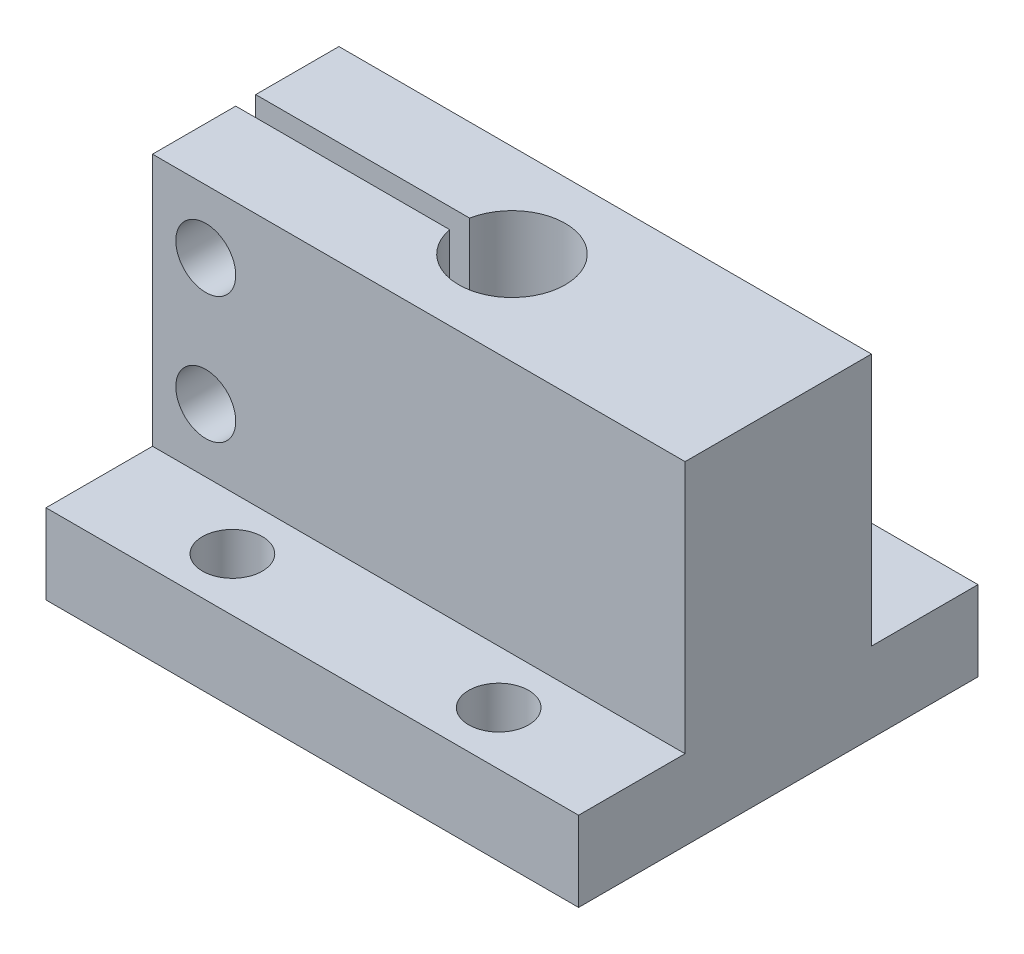
ISO-10303-21;
HEADER;
FILE_DESCRIPTION(('STEP AP214'),'2;1');
FILE_NAME('part.step','',(''),(''),'','','');
FILE_SCHEMA(('AUTOMOTIVE_DESIGN { 1 0 10303 214 1 1 1 1 }'));
ENDSEC;
DATA;
#1=APPLICATION_CONTEXT('core data for automotive mechanical design processes');
#2=APPLICATION_PROTOCOL_DEFINITION('international standard','automotive_design',2000,#1);
#3=PRODUCT_CONTEXT('',#1,'mechanical');
#4=PRODUCT('Part','Part','',(#3));
#5=PRODUCT_RELATED_PRODUCT_CATEGORY('part','',(#4));
#6=PRODUCT_DEFINITION_FORMATION('','',#4);
#7=PRODUCT_DEFINITION_CONTEXT('part definition',#1,'design');
#8=PRODUCT_DEFINITION('design','',#6,#7);
#9=PRODUCT_DEFINITION_SHAPE('','',#8);
#10=(LENGTH_UNIT() NAMED_UNIT(*) SI_UNIT(.MILLI.,.METRE.));
#11=(NAMED_UNIT(*) PLANE_ANGLE_UNIT() SI_UNIT($,.RADIAN.));
#12=(NAMED_UNIT(*) SI_UNIT($,.STERADIAN.) SOLID_ANGLE_UNIT());
#13=UNCERTAINTY_MEASURE_WITH_UNIT(LENGTH_MEASURE(1.E-05),#10,'distance_accuracy_value','');
#14=(GEOMETRIC_REPRESENTATION_CONTEXT(3) GLOBAL_UNCERTAINTY_ASSIGNED_CONTEXT((#13)) GLOBAL_UNIT_ASSIGNED_CONTEXT((#10,
#11,#12)) REPRESENTATION_CONTEXT('',''));
#15=CARTESIAN_POINT('',(0.,0.,0.));
#16=DIRECTION('',(0.,0.,1.));
#17=DIRECTION('',(1.,0.,0.));
#18=AXIS2_PLACEMENT_3D('',#15,#16,#17);
#19=CARTESIAN_POINT('',(-20.,25.,0.));
#20=DIRECTION('',(1.,0.,0.));
#21=DIRECTION('',(0.,0.,-1.));
#22=AXIS2_PLACEMENT_3D('',#19,#20,#21);
#23=PLANE('',#22);
#24=DIRECTION('',(0.,0.,1.));
#25=VECTOR('',#24,1.);
#26=CARTESIAN_POINT('',(-20.,0.,0.));
#27=LINE('',#26,#25);
#28=CARTESIAN_POINT('',(-20.,0.,-15.));
#29=VERTEX_POINT('',#28);
#30=CARTESIAN_POINT('',(-20.,0.,-0.749999999999999));
#31=VERTEX_POINT('',#30);
#32=EDGE_CURVE('E153',#29,#31,#27,.T.);
#33=ORIENTED_EDGE('',*,*,#32,.T.);
#34=DIRECTION('',(0.,1.,0.));
#35=VECTOR('',#34,1.);
#36=CARTESIAN_POINT('',(-20.,0.,-0.749999999999999));
#37=LINE('',#36,#35);
#38=CARTESIAN_POINT('',(-20.,25.,-0.749999999999999));
#39=VERTEX_POINT('',#38);
#40=EDGE_CURVE('E58',#31,#39,#37,.T.);
#41=ORIENTED_EDGE('',*,*,#40,.T.);
#42=DIRECTION('',(0.,0.,1.));
#43=VECTOR('',#42,1.);
#44=CARTESIAN_POINT('',(-20.,25.,0.));
#45=LINE('',#44,#43);
#46=CARTESIAN_POINT('',(-20.,25.,-7.));
#47=VERTEX_POINT('',#46);
#48=EDGE_CURVE('E165',#47,#39,#45,.T.);
#49=ORIENTED_EDGE('',*,*,#48,.F.);
#50=DIRECTION('',(0.,-1.,0.));
#51=VECTOR('',#50,1.);
#52=CARTESIAN_POINT('',(-20.,25.,-7.));
#53=LINE('',#52,#51);
#54=CARTESIAN_POINT('',(-20.,6.,-7.));
#55=VERTEX_POINT('',#54);
#56=EDGE_CURVE('E164',#47,#55,#53,.T.);
#57=ORIENTED_EDGE('',*,*,#56,.T.);
#58=DIRECTION('',(0.,0.,1.));
#59=VECTOR('',#58,1.);
#60=CARTESIAN_POINT('',(-20.,6.,0.));
#61=LINE('',#60,#59);
#62=CARTESIAN_POINT('',(-20.,6.,-15.));
#63=VERTEX_POINT('',#62);
#64=EDGE_CURVE('E214',#63,#55,#61,.T.);
#65=ORIENTED_EDGE('',*,*,#64,.F.);
#66=DIRECTION('',(0.,-1.,0.));
#67=VECTOR('',#66,1.);
#68=CARTESIAN_POINT('',(-20.,6.,-15.));
#69=LINE('',#68,#67);
#70=EDGE_CURVE('E222',#63,#29,#69,.T.);
#71=ORIENTED_EDGE('',*,*,#70,.T.);
#72=EDGE_LOOP('',(#33,#41,#49,#57,#65,#71));
#73=FACE_BOUND('',#72,.T.);
#74=ADVANCED_FACE('F41',(#73),#23,.F.);
#75=CARTESIAN_POINT('',(0.,25.,7.));
#76=DIRECTION('',(0.,0.,1.));
#77=DIRECTION('',(1.,0.,0.));
#78=AXIS2_PLACEMENT_3D('',#75,#76,#77);
#79=PLANE('',#78);
#80=CARTESIAN_POINT('',(-16.,20.25,7.));
#81=DIRECTION('',(0.,0.,1.));
#82=DIRECTION('',(1.,0.,0.));
#83=AXIS2_PLACEMENT_3D('',#80,#81,#82);
#84=CIRCLE('',#83,2.25);
#85=CARTESIAN_POINT('',(-13.75,20.25,7.));
#86=VERTEX_POINT('',#85);
#87=EDGE_CURVE('E175',#86,#86,#84,.T.);
#88=ORIENTED_EDGE('',*,*,#87,.F.);
#89=EDGE_LOOP('',(#88));
#90=FACE_BOUND('',#89,.T.);
#91=CARTESIAN_POINT('',(-16.,10.75,7.));
#92=DIRECTION('',(0.,0.,1.));
#93=DIRECTION('',(-1.,0.,0.));
#94=AXIS2_PLACEMENT_3D('',#91,#92,#93);
#95=CIRCLE('',#94,2.25);
#96=CARTESIAN_POINT('',(-18.25,10.75,7.));
#97=VERTEX_POINT('',#96);
#98=EDGE_CURVE('E182',#97,#97,#95,.T.);
#99=ORIENTED_EDGE('',*,*,#98,.F.);
#100=EDGE_LOOP('',(#99));
#101=FACE_BOUND('',#100,.T.);
#102=DIRECTION('',(-1.,0.,0.));
#103=VECTOR('',#102,1.);
#104=CARTESIAN_POINT('',(0.,6.,7.));
#105=LINE('',#104,#103);
#106=CARTESIAN_POINT('',(20.,6.,7.));
#107=VERTEX_POINT('',#106);
#108=CARTESIAN_POINT('',(-20.,6.,7.));
#109=VERTEX_POINT('',#108);
#110=EDGE_CURVE('E238',#107,#109,#105,.T.);
#111=ORIENTED_EDGE('',*,*,#110,.F.);
#112=DIRECTION('',(0.,-1.,0.));
#113=VECTOR('',#112,1.);
#114=CARTESIAN_POINT('',(20.,25.,7.));
#115=LINE('',#114,#113);
#116=CARTESIAN_POINT('',(20.,25.,7.));
#117=VERTEX_POINT('',#116);
#118=EDGE_CURVE('E50',#117,#107,#115,.T.);
#119=ORIENTED_EDGE('',*,*,#118,.F.);
#120=DIRECTION('',(-1.,0.,0.));
#121=VECTOR('',#120,1.);
#122=CARTESIAN_POINT('',(0.,25.,7.));
#123=LINE('',#122,#121);
#124=CARTESIAN_POINT('',(-20.,25.,7.));
#125=VERTEX_POINT('',#124);
#126=EDGE_CURVE('E266',#117,#125,#123,.T.);
#127=ORIENTED_EDGE('',*,*,#126,.T.);
#128=DIRECTION('',(0.,-1.,0.));
#129=VECTOR('',#128,1.);
#130=CARTESIAN_POINT('',(-20.,25.,7.));
#131=LINE('',#130,#129);
#132=EDGE_CURVE('E162',#125,#109,#131,.T.);
#133=ORIENTED_EDGE('',*,*,#132,.T.);
#134=EDGE_LOOP('',(#111,#119,#127,#133));
#135=FACE_BOUND('',#134,.T.);
#136=ADVANCED_FACE('F305',(#90,#101,#135),#79,.T.);
#137=CARTESIAN_POINT('',(20.,25.,0.));
#138=DIRECTION('',(1.,0.,0.));
#139=DIRECTION('',(0.,0.,-1.));
#140=AXIS2_PLACEMENT_3D('',#137,#138,#139);
#141=PLANE('',#140);
#142=DIRECTION('',(0.,0.,1.));
#143=VECTOR('',#142,1.);
#144=CARTESIAN_POINT('',(20.,0.,0.));
#145=LINE('',#144,#143);
#146=CARTESIAN_POINT('',(20.,0.,-15.));
#147=VERTEX_POINT('',#146);
#148=CARTESIAN_POINT('',(20.,0.,15.));
#149=VERTEX_POINT('',#148);
#150=EDGE_CURVE('E154',#147,#149,#145,.T.);
#151=ORIENTED_EDGE('',*,*,#150,.F.);
#152=DIRECTION('',(0.,-1.,0.));
#153=VECTOR('',#152,1.);
#154=CARTESIAN_POINT('',(20.,6.,-15.));
#155=LINE('',#154,#153);
#156=CARTESIAN_POINT('',(20.,6.,-15.));
#157=VERTEX_POINT('',#156);
#158=EDGE_CURVE('E232',#157,#147,#155,.T.);
#159=ORIENTED_EDGE('',*,*,#158,.F.);
#160=DIRECTION('',(0.,0.,1.));
#161=VECTOR('',#160,1.);
#162=CARTESIAN_POINT('',(20.,6.,0.));
#163=LINE('',#162,#161);
#164=CARTESIAN_POINT('',(20.,6.,-7.));
#165=VERTEX_POINT('',#164);
#166=EDGE_CURVE('E208',#157,#165,#163,.T.);
#167=ORIENTED_EDGE('',*,*,#166,.T.);
#168=DIRECTION('',(0.,-1.,0.));
#169=VECTOR('',#168,1.);
#170=CARTESIAN_POINT('',(20.,25.,-7.));
#171=LINE('',#170,#169);
#172=CARTESIAN_POINT('',(20.,25.,-7.));
#173=VERTEX_POINT('',#172);
#174=EDGE_CURVE('E168',#173,#165,#171,.T.);
#175=ORIENTED_EDGE('',*,*,#174,.F.);
#176=DIRECTION('',(0.,0.,1.));
#177=VECTOR('',#176,1.);
#178=CARTESIAN_POINT('',(20.,25.,0.));
#179=LINE('',#178,#177);
#180=EDGE_CURVE('E269',#173,#117,#179,.T.);
#181=ORIENTED_EDGE('',*,*,#180,.T.);
#182=ORIENTED_EDGE('',*,*,#118,.T.);
#183=DIRECTION('',(0.,0.,1.));
#184=VECTOR('',#183,1.);
#185=CARTESIAN_POINT('',(20.,6.,0.));
#186=LINE('',#185,#184);
#187=CARTESIAN_POINT('',(20.,6.,15.));
#188=VERTEX_POINT('',#187);
#189=EDGE_CURVE('E235',#107,#188,#186,.T.);
#190=ORIENTED_EDGE('',*,*,#189,.T.);
#191=DIRECTION('',(0.,-1.,0.));
#192=VECTOR('',#191,1.);
#193=CARTESIAN_POINT('',(20.,6.,15.));
#194=LINE('',#193,#192);
#195=EDGE_CURVE('E253',#188,#149,#194,.T.);
#196=ORIENTED_EDGE('',*,*,#195,.T.);
#197=EDGE_LOOP('',(#151,#159,#167,#175,#181,#182,#190,#196));
#198=FACE_BOUND('',#197,.T.);
#199=ADVANCED_FACE('F295',(#198),#141,.T.);
#200=CARTESIAN_POINT('',(0.,25.,-7.));
#201=DIRECTION('',(0.,0.,1.));
#202=DIRECTION('',(1.,0.,0.));
#203=AXIS2_PLACEMENT_3D('',#200,#201,#202);
#204=PLANE('',#203);
#205=CARTESIAN_POINT('',(-16.,20.25,-7.));
#206=DIRECTION('',(0.,0.,1.));
#207=DIRECTION('',(1.,0.,0.));
#208=AXIS2_PLACEMENT_3D('',#205,#206,#207);
#209=CIRCLE('',#208,2.25);
#210=CARTESIAN_POINT('',(-13.75,20.25,-7.));
#211=VERTEX_POINT('',#210);
#212=EDGE_CURVE('E194',#211,#211,#209,.T.);
#213=ORIENTED_EDGE('',*,*,#212,.T.);
#214=EDGE_LOOP('',(#213));
#215=FACE_BOUND('',#214,.T.);
#216=CARTESIAN_POINT('',(-16.,10.75,-7.));
#217=DIRECTION('',(0.,0.,1.));
#218=DIRECTION('',(1.,0.,0.));
#219=AXIS2_PLACEMENT_3D('',#216,#217,#218);
#220=CIRCLE('',#219,2.25);
#221=CARTESIAN_POINT('',(-13.75,10.75,-7.));
#222=VERTEX_POINT('',#221);
#223=EDGE_CURVE('E179',#222,#222,#220,.T.);
#224=ORIENTED_EDGE('',*,*,#223,.T.);
#225=EDGE_LOOP('',(#224));
#226=FACE_BOUND('',#225,.T.);
#227=ORIENTED_EDGE('',*,*,#174,.T.);
#228=DIRECTION('',(-1.,0.,0.));
#229=VECTOR('',#228,1.);
#230=CARTESIAN_POINT('',(0.,6.,-7.));
#231=LINE('',#230,#229);
#232=EDGE_CURVE('E205',#165,#55,#231,.T.);
#233=ORIENTED_EDGE('',*,*,#232,.T.);
#234=ORIENTED_EDGE('',*,*,#56,.F.);
#235=DIRECTION('',(-1.,0.,0.));
#236=VECTOR('',#235,1.);
#237=CARTESIAN_POINT('',(0.,25.,-7.));
#238=LINE('',#237,#236);
#239=EDGE_CURVE('E272',#173,#47,#238,.T.);
#240=ORIENTED_EDGE('',*,*,#239,.F.);
#241=EDGE_LOOP('',(#227,#233,#234,#240));
#242=FACE_BOUND('',#241,.T.);
#243=ADVANCED_FACE('F308',(#215,#226,#242),#204,.F.);
#244=CARTESIAN_POINT('',(0.,25.,0.));
#245=DIRECTION('',(0.,-1.,0.));
#246=DIRECTION('',(0.,0.,-1.));
#247=AXIS2_PLACEMENT_3D('',#244,#245,#246);
#248=CYLINDRICAL_SURFACE('',#247,4.);
#249=DIRECTION('',(0.,-1.,0.));
#250=VECTOR('',#249,1.);
#251=CARTESIAN_POINT('',(-3.92905841137541,25.,-0.749999999999999));
#252=LINE('',#251,#250);
#253=CARTESIAN_POINT('',(-3.92905841137541,0.,-0.749999999999999));
#254=VERTEX_POINT('',#253);
#255=CARTESIAN_POINT('',(-3.92905841137541,25.,-0.749999999999999));
#256=VERTEX_POINT('',#255);
#257=EDGE_CURVE('E202',#254,#256,#252,.F.);
#258=ORIENTED_EDGE('',*,*,#257,.F.);
#259=CARTESIAN_POINT('',(0.,0.,0.));
#260=DIRECTION('',(0.,1.,0.));
#261=DIRECTION('',(0.,0.,1.));
#262=AXIS2_PLACEMENT_3D('',#259,#260,#261);
#263=CIRCLE('',#262,4.);
#264=CARTESIAN_POINT('',(-3.92905841137541,0.,0.750000000000001));
#265=VERTEX_POINT('',#264);
#266=EDGE_CURVE('E158',#265,#254,#263,.T.);
#267=ORIENTED_EDGE('',*,*,#266,.F.);
#268=DIRECTION('',(0.,-1.,0.));
#269=VECTOR('',#268,1.);
#270=CARTESIAN_POINT('',(-3.92905841137541,25.,0.750000000000001));
#271=LINE('',#270,#269);
#272=CARTESIAN_POINT('',(-3.92905841137541,25.,0.750000000000001));
#273=VERTEX_POINT('',#272);
#274=EDGE_CURVE('E65',#273,#265,#271,.T.);
#275=ORIENTED_EDGE('',*,*,#274,.F.);
#276=CARTESIAN_POINT('',(0.,25.,0.));
#277=DIRECTION('',(0.,1.,0.));
#278=DIRECTION('',(0.,0.,1.));
#279=AXIS2_PLACEMENT_3D('',#276,#277,#278);
#280=CIRCLE('',#279,4.);
#281=EDGE_CURVE('E157',#273,#256,#280,.T.);
#282=ORIENTED_EDGE('',*,*,#281,.T.);
#283=EDGE_LOOP('',(#258,#267,#275,#282));
#284=FACE_BOUND('',#283,.T.);
#285=ADVANCED_FACE('F43',(#284),#248,.F.);
#286=CARTESIAN_POINT('',(-20.,25.,0.750000000000001));
#287=VERTEX_POINT('',#286);
#288=EDGE_CURVE('E146',#287,#125,#45,.T.);
#289=ORIENTED_EDGE('',*,*,#288,.F.);
#290=DIRECTION('',(0.,1.,0.));
#291=VECTOR('',#290,1.);
#292=CARTESIAN_POINT('',(-20.,0.,0.750000000000001));
#293=LINE('',#292,#291);
#294=CARTESIAN_POINT('',(-20.,0.,0.750000000000001));
#295=VERTEX_POINT('',#294);
#296=EDGE_CURVE('E131',#295,#287,#293,.T.);
#297=ORIENTED_EDGE('',*,*,#296,.F.);
#298=CARTESIAN_POINT('',(-20.,0.,15.));
#299=VERTEX_POINT('',#298);
#300=EDGE_CURVE('E143',#295,#299,#27,.T.);
#301=ORIENTED_EDGE('',*,*,#300,.T.);
#302=DIRECTION('',(0.,-1.,0.));
#303=VECTOR('',#302,1.);
#304=CARTESIAN_POINT('',(-20.,6.,15.));
#305=LINE('',#304,#303);
#306=CARTESIAN_POINT('',(-20.,6.,15.));
#307=VERTEX_POINT('',#306);
#308=EDGE_CURVE('E262',#307,#299,#305,.T.);
#309=ORIENTED_EDGE('',*,*,#308,.F.);
#310=DIRECTION('',(0.,0.,1.));
#311=VECTOR('',#310,1.);
#312=CARTESIAN_POINT('',(-20.,6.,0.));
#313=LINE('',#312,#311);
#314=EDGE_CURVE('E242',#109,#307,#313,.T.);
#315=ORIENTED_EDGE('',*,*,#314,.F.);
#316=ORIENTED_EDGE('',*,*,#132,.F.);
#317=EDGE_LOOP('',(#289,#297,#301,#309,#315,#316));
#318=FACE_BOUND('',#317,.T.);
#319=ADVANCED_FACE('F141',(#318),#23,.F.);
#320=CARTESIAN_POINT('',(0.,25.,0.));
#321=DIRECTION('',(0.,1.,0.));
#322=DIRECTION('',(0.,0.,1.));
#323=AXIS2_PLACEMENT_3D('',#320,#321,#322);
#324=PLANE('',#323);
#325=DIRECTION('',(-1.,0.,0.));
#326=VECTOR('',#325,1.);
#327=CARTESIAN_POINT('',(0.,25.,-0.749999999999999));
#328=LINE('',#327,#326);
#329=EDGE_CURVE('E137',#256,#39,#328,.T.);
#330=ORIENTED_EDGE('',*,*,#329,.F.);
#331=ORIENTED_EDGE('',*,*,#281,.F.);
#332=DIRECTION('',(1.,0.,0.));
#333=VECTOR('',#332,1.);
#334=CARTESIAN_POINT('',(0.,25.,0.750000000000001));
#335=LINE('',#334,#333);
#336=EDGE_CURVE('E196',#287,#273,#335,.T.);
#337=ORIENTED_EDGE('',*,*,#336,.F.);
#338=ORIENTED_EDGE('',*,*,#288,.T.);
#339=ORIENTED_EDGE('',*,*,#126,.F.);
#340=ORIENTED_EDGE('',*,*,#180,.F.);
#341=ORIENTED_EDGE('',*,*,#239,.T.);
#342=ORIENTED_EDGE('',*,*,#48,.T.);
#343=EDGE_LOOP('',(#330,#331,#337,#338,#339,#340,#341,#342));
#344=FACE_BOUND('',#343,.T.);
#345=ADVANCED_FACE('F282',(#344),#324,.T.);
#346=CARTESIAN_POINT('',(0.,0.,0.));
#347=DIRECTION('',(0.,1.,0.));
#348=DIRECTION('',(0.,0.,1.));
#349=AXIS2_PLACEMENT_3D('',#346,#347,#348);
#350=PLANE('',#349);
#351=ORIENTED_EDGE('',*,*,#266,.T.);
#352=DIRECTION('',(-1.,0.,0.));
#353=VECTOR('',#352,1.);
#354=CARTESIAN_POINT('',(0.,0.,-0.749999999999999));
#355=LINE('',#354,#353);
#356=EDGE_CURVE('E11',#254,#31,#355,.T.);
#357=ORIENTED_EDGE('',*,*,#356,.T.);
#358=ORIENTED_EDGE('',*,*,#32,.F.);
#359=DIRECTION('',(-1.,0.,0.));
#360=VECTOR('',#359,1.);
#361=CARTESIAN_POINT('',(0.,0.,-15.));
#362=LINE('',#361,#360);
#363=EDGE_CURVE('E204',#147,#29,#362,.T.);
#364=ORIENTED_EDGE('',*,*,#363,.F.);
#365=ORIENTED_EDGE('',*,*,#150,.T.);
#366=DIRECTION('',(-1.,0.,0.));
#367=VECTOR('',#366,1.);
#368=CARTESIAN_POINT('',(0.,0.,15.));
#369=LINE('',#368,#367);
#370=EDGE_CURVE('E152',#149,#299,#369,.T.);
#371=ORIENTED_EDGE('',*,*,#370,.T.);
#372=ORIENTED_EDGE('',*,*,#300,.F.);
#373=DIRECTION('',(1.,0.,0.));
#374=VECTOR('',#373,1.);
#375=CARTESIAN_POINT('',(0.,0.,0.750000000000001));
#376=LINE('',#375,#374);
#377=EDGE_CURVE('E128',#295,#265,#376,.T.);
#378=ORIENTED_EDGE('',*,*,#377,.T.);
#379=EDGE_LOOP('',(#351,#357,#358,#364,#365,#371,#372,#378));
#380=FACE_BOUND('',#379,.T.);
#381=CARTESIAN_POINT('',(-9.99999999999999,0.,11.));
#382=DIRECTION('',(0.,1.,0.));
#383=DIRECTION('',(0.,0.,1.));
#384=AXIS2_PLACEMENT_3D('',#381,#382,#383);
#385=CIRCLE('',#384,2.25);
#386=CARTESIAN_POINT('',(-9.99999999999999,0.,13.25));
#387=VERTEX_POINT('',#386);
#388=EDGE_CURVE('E255',#387,#387,#385,.T.);
#389=ORIENTED_EDGE('',*,*,#388,.T.);
#390=EDGE_LOOP('',(#389));
#391=FACE_BOUND('',#390,.T.);
#392=CARTESIAN_POINT('',(10.,0.,11.));
#393=DIRECTION('',(0.,1.,0.));
#394=DIRECTION('',(0.,0.,1.));
#395=AXIS2_PLACEMENT_3D('',#392,#393,#394);
#396=CIRCLE('',#395,2.25);
#397=CARTESIAN_POINT('',(10.,0.,13.25));
#398=VERTEX_POINT('',#397);
#399=EDGE_CURVE('E239',#398,#398,#396,.F.);
#400=ORIENTED_EDGE('',*,*,#399,.F.);
#401=EDGE_LOOP('',(#400));
#402=FACE_BOUND('',#401,.T.);
#403=CARTESIAN_POINT('',(9.99999999999998,0.,-11.));
#404=DIRECTION('',(0.,1.,0.));
#405=DIRECTION('',(0.,0.,1.));
#406=AXIS2_PLACEMENT_3D('',#403,#404,#405);
#407=CIRCLE('',#406,2.25);
#408=CARTESIAN_POINT('',(9.99999999999998,0.,-8.74999999999999));
#409=VERTEX_POINT('',#408);
#410=EDGE_CURVE('E225',#409,#409,#407,.T.);
#411=ORIENTED_EDGE('',*,*,#410,.T.);
#412=EDGE_LOOP('',(#411));
#413=FACE_BOUND('',#412,.T.);
#414=CARTESIAN_POINT('',(-10.,0.,-11.));
#415=DIRECTION('',(0.,1.,0.));
#416=DIRECTION('',(0.,0.,1.));
#417=AXIS2_PLACEMENT_3D('',#414,#415,#416);
#418=CIRCLE('',#417,2.25);
#419=CARTESIAN_POINT('',(-10.,0.,-8.75000000000001));
#420=VERTEX_POINT('',#419);
#421=EDGE_CURVE('E209',#420,#420,#418,.F.);
#422=ORIENTED_EDGE('',*,*,#421,.F.);
#423=EDGE_LOOP('',(#422));
#424=FACE_BOUND('',#423,.T.);
#425=ADVANCED_FACE('F149',(#380,#391,#402,#413,#424),#350,.F.);
#426=CARTESIAN_POINT('',(-9.99999999999999,6.,11.));
#427=DIRECTION('',(0.,-1.,0.));
#428=DIRECTION('',(0.,0.,-1.));
#429=AXIS2_PLACEMENT_3D('',#426,#427,#428);
#430=CYLINDRICAL_SURFACE('',#429,2.25);
#431=CARTESIAN_POINT('',(-9.99999999999999,6.,11.));
#432=DIRECTION('',(0.,1.,0.));
#433=DIRECTION('',(0.,0.,1.));
#434=AXIS2_PLACEMENT_3D('',#431,#432,#433);
#435=CIRCLE('',#434,2.25);
#436=CARTESIAN_POINT('',(-9.99999999999999,6.,13.25));
#437=VERTEX_POINT('',#436);
#438=EDGE_CURVE('E247',#437,#437,#435,.T.);
#439=ORIENTED_EDGE('',*,*,#438,.T.);
#440=EDGE_LOOP('',(#439));
#441=FACE_BOUND('',#440,.T.);
#442=ORIENTED_EDGE('',*,*,#388,.F.);
#443=EDGE_LOOP('',(#442));
#444=FACE_BOUND('',#443,.T.);
#445=ADVANCED_FACE('F326',(#441,#444),#430,.F.);
#446=CARTESIAN_POINT('',(0.,6.,15.));
#447=DIRECTION('',(0.,0.,1.));
#448=DIRECTION('',(1.,0.,0.));
#449=AXIS2_PLACEMENT_3D('',#446,#447,#448);
#450=PLANE('',#449);
#451=ORIENTED_EDGE('',*,*,#370,.F.);
#452=ORIENTED_EDGE('',*,*,#195,.F.);
#453=DIRECTION('',(-1.,0.,0.));
#454=VECTOR('',#453,1.);
#455=CARTESIAN_POINT('',(0.,6.,15.));
#456=LINE('',#455,#454);
#457=EDGE_CURVE('E244',#188,#307,#456,.T.);
#458=ORIENTED_EDGE('',*,*,#457,.T.);
#459=ORIENTED_EDGE('',*,*,#308,.T.);
#460=EDGE_LOOP('',(#451,#452,#458,#459));
#461=FACE_BOUND('',#460,.T.);
#462=ADVANCED_FACE('F299',(#461),#450,.T.);
#463=CARTESIAN_POINT('',(10.,6.,11.));
#464=DIRECTION('',(0.,-1.,0.));
#465=DIRECTION('',(0.,0.,-1.));
#466=AXIS2_PLACEMENT_3D('',#463,#464,#465);
#467=CYLINDRICAL_SURFACE('',#466,2.25);
#468=CARTESIAN_POINT('',(10.,6.,11.));
#469=DIRECTION('',(0.,1.,0.));
#470=DIRECTION('',(0.,0.,1.));
#471=AXIS2_PLACEMENT_3D('',#468,#469,#470);
#472=CIRCLE('',#471,2.25);
#473=CARTESIAN_POINT('',(10.,6.,13.25));
#474=VERTEX_POINT('',#473);
#475=EDGE_CURVE('E250',#474,#474,#472,.F.);
#476=ORIENTED_EDGE('',*,*,#475,.F.);
#477=EDGE_LOOP('',(#476));
#478=FACE_BOUND('',#477,.T.);
#479=ORIENTED_EDGE('',*,*,#399,.T.);
#480=EDGE_LOOP('',(#479));
#481=FACE_BOUND('',#480,.T.);
#482=ADVANCED_FACE('F395',(#478,#481),#467,.F.);
#483=CARTESIAN_POINT('',(0.,6.,0.));
#484=DIRECTION('',(0.,1.,0.));
#485=DIRECTION('',(0.,0.,1.));
#486=AXIS2_PLACEMENT_3D('',#483,#484,#485);
#487=PLANE('',#486);
#488=ORIENTED_EDGE('',*,*,#189,.F.);
#489=ORIENTED_EDGE('',*,*,#110,.T.);
#490=ORIENTED_EDGE('',*,*,#314,.T.);
#491=ORIENTED_EDGE('',*,*,#457,.F.);
#492=EDGE_LOOP('',(#488,#489,#490,#491));
#493=FACE_BOUND('',#492,.T.);
#494=ORIENTED_EDGE('',*,*,#438,.F.);
#495=EDGE_LOOP('',(#494));
#496=FACE_BOUND('',#495,.T.);
#497=ORIENTED_EDGE('',*,*,#475,.T.);
#498=EDGE_LOOP('',(#497));
#499=FACE_BOUND('',#498,.T.);
#500=ADVANCED_FACE('F302',(#493,#496,#499),#487,.T.);
#501=CARTESIAN_POINT('',(0.,6.,-15.));
#502=DIRECTION('',(0.,0.,1.));
#503=DIRECTION('',(1.,0.,0.));
#504=AXIS2_PLACEMENT_3D('',#501,#502,#503);
#505=PLANE('',#504);
#506=ORIENTED_EDGE('',*,*,#363,.T.);
#507=ORIENTED_EDGE('',*,*,#70,.F.);
#508=DIRECTION('',(-1.,0.,0.));
#509=VECTOR('',#508,1.);
#510=CARTESIAN_POINT('',(0.,6.,-15.));
#511=LINE('',#510,#509);
#512=EDGE_CURVE('E212',#157,#63,#511,.T.);
#513=ORIENTED_EDGE('',*,*,#512,.F.);
#514=ORIENTED_EDGE('',*,*,#158,.T.);
#515=EDGE_LOOP('',(#506,#507,#513,#514));
#516=FACE_BOUND('',#515,.T.);
#517=ADVANCED_FACE('F291',(#516),#505,.F.);
#518=CARTESIAN_POINT('',(9.99999999999998,6.,-11.));
#519=DIRECTION('',(0.,-1.,0.));
#520=DIRECTION('',(0.,0.,-1.));
#521=AXIS2_PLACEMENT_3D('',#518,#519,#520);
#522=CYLINDRICAL_SURFACE('',#521,2.25);
#523=CARTESIAN_POINT('',(9.99999999999998,6.,-11.));
#524=DIRECTION('',(0.,1.,0.));
#525=DIRECTION('',(0.,0.,1.));
#526=AXIS2_PLACEMENT_3D('',#523,#524,#525);
#527=CIRCLE('',#526,2.25);
#528=CARTESIAN_POINT('',(9.99999999999998,6.,-8.74999999999999));
#529=VERTEX_POINT('',#528);
#530=EDGE_CURVE('E216',#529,#529,#527,.T.);
#531=ORIENTED_EDGE('',*,*,#530,.T.);
#532=EDGE_LOOP('',(#531));
#533=FACE_BOUND('',#532,.T.);
#534=ORIENTED_EDGE('',*,*,#410,.F.);
#535=EDGE_LOOP('',(#534));
#536=FACE_BOUND('',#535,.T.);
#537=ADVANCED_FACE('F321',(#533,#536),#522,.F.);
#538=CARTESIAN_POINT('',(-10.,6.,-11.));
#539=DIRECTION('',(0.,-1.,0.));
#540=DIRECTION('',(0.,0.,-1.));
#541=AXIS2_PLACEMENT_3D('',#538,#539,#540);
#542=CYLINDRICAL_SURFACE('',#541,2.25);
#543=CARTESIAN_POINT('',(-10.,6.,-11.));
#544=DIRECTION('',(0.,1.,0.));
#545=DIRECTION('',(0.,0.,1.));
#546=AXIS2_PLACEMENT_3D('',#543,#544,#545);
#547=CIRCLE('',#546,2.25);
#548=CARTESIAN_POINT('',(-10.,6.,-8.75000000000001));
#549=VERTEX_POINT('',#548);
#550=EDGE_CURVE('E219',#549,#549,#547,.F.);
#551=ORIENTED_EDGE('',*,*,#550,.F.);
#552=EDGE_LOOP('',(#551));
#553=FACE_BOUND('',#552,.T.);
#554=ORIENTED_EDGE('',*,*,#421,.T.);
#555=EDGE_LOOP('',(#554));
#556=FACE_BOUND('',#555,.T.);
#557=ADVANCED_FACE('F313',(#553,#556),#542,.F.);
#558=CARTESIAN_POINT('',(0.,6.,0.));
#559=DIRECTION('',(0.,1.,0.));
#560=DIRECTION('',(0.,0.,1.));
#561=AXIS2_PLACEMENT_3D('',#558,#559,#560);
#562=PLANE('',#561);
#563=ORIENTED_EDGE('',*,*,#232,.F.);
#564=ORIENTED_EDGE('',*,*,#166,.F.);
#565=ORIENTED_EDGE('',*,*,#512,.T.);
#566=ORIENTED_EDGE('',*,*,#64,.T.);
#567=EDGE_LOOP('',(#563,#564,#565,#566));
#568=FACE_BOUND('',#567,.T.);
#569=ORIENTED_EDGE('',*,*,#530,.F.);
#570=EDGE_LOOP('',(#569));
#571=FACE_BOUND('',#570,.T.);
#572=ORIENTED_EDGE('',*,*,#550,.T.);
#573=EDGE_LOOP('',(#572));
#574=FACE_BOUND('',#573,.T.);
#575=ADVANCED_FACE('F310',(#568,#571,#574),#562,.T.);
#576=CARTESIAN_POINT('',(0.,0.,0.750000000000001));
#577=DIRECTION('',(0.,0.,1.));
#578=DIRECTION('',(1.,0.,0.));
#579=AXIS2_PLACEMENT_3D('',#576,#577,#578);
#580=PLANE('',#579);
#581=CARTESIAN_POINT('',(-16.,20.25,0.750000000000001));
#582=DIRECTION('',(0.,0.,1.));
#583=DIRECTION('',(1.,0.,0.));
#584=AXIS2_PLACEMENT_3D('',#581,#582,#583);
#585=CIRCLE('',#584,2.25);
#586=CARTESIAN_POINT('',(-13.75,20.25,0.750000000000001));
#587=VERTEX_POINT('',#586);
#588=EDGE_CURVE('E191',#587,#587,#585,.T.);
#589=ORIENTED_EDGE('',*,*,#588,.T.);
#590=EDGE_LOOP('',(#589));
#591=FACE_BOUND('',#590,.T.);
#592=CARTESIAN_POINT('',(-16.,10.75,0.750000000000001));
#593=DIRECTION('',(0.,0.,1.));
#594=DIRECTION('',(1.,0.,0.));
#595=AXIS2_PLACEMENT_3D('',#592,#593,#594);
#596=CIRCLE('',#595,2.25);
#597=CARTESIAN_POINT('',(-13.75,10.75,0.750000000000001));
#598=VERTEX_POINT('',#597);
#599=EDGE_CURVE('E174',#598,#598,#596,.T.);
#600=ORIENTED_EDGE('',*,*,#599,.T.);
#601=EDGE_LOOP('',(#600));
#602=FACE_BOUND('',#601,.T.);
#603=ORIENTED_EDGE('',*,*,#274,.T.);
#604=ORIENTED_EDGE('',*,*,#377,.F.);
#605=ORIENTED_EDGE('',*,*,#296,.T.);
#606=ORIENTED_EDGE('',*,*,#336,.T.);
#607=EDGE_LOOP('',(#603,#604,#605,#606));
#608=FACE_BOUND('',#607,.T.);
#609=ADVANCED_FACE('F130',(#591,#602,#608),#580,.F.);
#610=CARTESIAN_POINT('',(0.,0.,-0.749999999999999));
#611=DIRECTION('',(0.,0.,-1.));
#612=DIRECTION('',(-1.,0.,0.));
#613=AXIS2_PLACEMENT_3D('',#610,#611,#612);
#614=PLANE('',#613);
#615=CARTESIAN_POINT('',(-16.,20.25,-0.749999999999999));
#616=DIRECTION('',(0.,0.,-1.));
#617=DIRECTION('',(-1.,0.,0.));
#618=AXIS2_PLACEMENT_3D('',#615,#616,#617);
#619=CIRCLE('',#618,2.25);
#620=CARTESIAN_POINT('',(-18.25,20.25,-0.749999999999999));
#621=VERTEX_POINT('',#620);
#622=EDGE_CURVE('E45',#621,#621,#619,.T.);
#623=ORIENTED_EDGE('',*,*,#622,.T.);
#624=EDGE_LOOP('',(#623));
#625=FACE_BOUND('',#624,.T.);
#626=CARTESIAN_POINT('',(-16.,10.75,-0.749999999999999));
#627=DIRECTION('',(0.,0.,-1.));
#628=DIRECTION('',(-1.,0.,0.));
#629=AXIS2_PLACEMENT_3D('',#626,#627,#628);
#630=CIRCLE('',#629,2.25);
#631=CARTESIAN_POINT('',(-18.25,10.75,-0.749999999999999));
#632=VERTEX_POINT('',#631);
#633=EDGE_CURVE('E172',#632,#632,#630,.T.);
#634=ORIENTED_EDGE('',*,*,#633,.T.);
#635=EDGE_LOOP('',(#634));
#636=FACE_BOUND('',#635,.T.);
#637=ORIENTED_EDGE('',*,*,#257,.T.);
#638=ORIENTED_EDGE('',*,*,#329,.T.);
#639=ORIENTED_EDGE('',*,*,#40,.F.);
#640=ORIENTED_EDGE('',*,*,#356,.F.);
#641=EDGE_LOOP('',(#637,#638,#639,#640));
#642=FACE_BOUND('',#641,.T.);
#643=ADVANCED_FACE('F280',(#625,#636,#642),#614,.F.);
#644=CARTESIAN_POINT('',(-16.,10.75,-15.));
#645=DIRECTION('',(0.,0.,1.));
#646=DIRECTION('',(1.,0.,0.));
#647=AXIS2_PLACEMENT_3D('',#644,#645,#646);
#648=CYLINDRICAL_SURFACE('',#647,2.25);
#649=ORIENTED_EDGE('',*,*,#633,.F.);
#650=EDGE_LOOP('',(#649));
#651=FACE_BOUND('',#650,.T.);
#652=ORIENTED_EDGE('',*,*,#223,.F.);
#653=EDGE_LOOP('',(#652));
#654=FACE_BOUND('',#653,.T.);
#655=ADVANCED_FACE('F359',(#651,#654),#648,.F.);
#656=CARTESIAN_POINT('',(-16.,20.25,-15.));
#657=DIRECTION('',(0.,0.,1.));
#658=DIRECTION('',(1.,0.,0.));
#659=AXIS2_PLACEMENT_3D('',#656,#657,#658);
#660=CYLINDRICAL_SURFACE('',#659,2.25);
#661=ORIENTED_EDGE('',*,*,#622,.F.);
#662=EDGE_LOOP('',(#661));
#663=FACE_BOUND('',#662,.T.);
#664=ORIENTED_EDGE('',*,*,#212,.F.);
#665=EDGE_LOOP('',(#664));
#666=FACE_BOUND('',#665,.T.);
#667=ADVANCED_FACE('F361',(#663,#666),#660,.F.);
#668=ORIENTED_EDGE('',*,*,#98,.T.);
#669=EDGE_LOOP('',(#668));
#670=FACE_BOUND('',#669,.T.);
#671=ORIENTED_EDGE('',*,*,#599,.F.);
#672=EDGE_LOOP('',(#671));
#673=FACE_BOUND('',#672,.T.);
#674=ADVANCED_FACE('F364',(#670,#673),#648,.F.);
#675=ORIENTED_EDGE('',*,*,#87,.T.);
#676=EDGE_LOOP('',(#675));
#677=FACE_BOUND('',#676,.T.);
#678=ORIENTED_EDGE('',*,*,#588,.F.);
#679=EDGE_LOOP('',(#678));
#680=FACE_BOUND('',#679,.T.);
#681=ADVANCED_FACE('F371',(#677,#680),#660,.F.);
#682=CLOSED_SHELL('',(#74,#136,#199,#243,#285,#319,#345,#425,#445,#462,#482,#500,#517,#537,#557,
#575,#609,#643,#655,#667,#674,#681));
#683=MANIFOLD_SOLID_BREP('B2',#682);
#684=ADVANCED_BREP_SHAPE_REPRESENTATION('',(#18,#683),#14);
#685=SHAPE_DEFINITION_REPRESENTATION(#9,#684);
ENDSEC;
END-ISO-10303-21;
